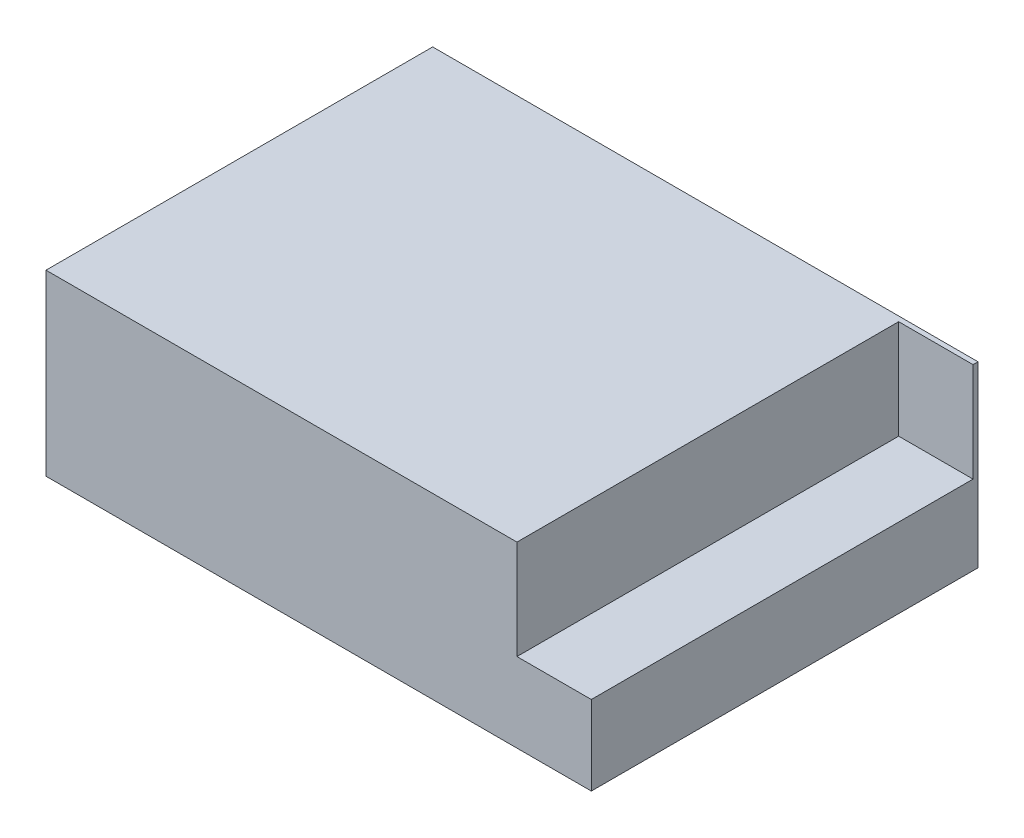
ISO-10303-21;
HEADER;
FILE_DESCRIPTION(('STEP AP214'),'2;1');
FILE_NAME('part.step','',(''),(''),'','','');
FILE_SCHEMA(('AUTOMOTIVE_DESIGN { 1 0 10303 214 1 1 1 1 }'));
ENDSEC;
DATA;
#1=APPLICATION_CONTEXT('core data for automotive mechanical design processes');
#2=APPLICATION_PROTOCOL_DEFINITION('international standard','automotive_design',2000,#1);
#3=PRODUCT_CONTEXT('',#1,'mechanical');
#4=PRODUCT('Part','Part','',(#3));
#5=PRODUCT_RELATED_PRODUCT_CATEGORY('part','',(#4));
#6=PRODUCT_DEFINITION_FORMATION('','',#4);
#7=PRODUCT_DEFINITION_CONTEXT('part definition',#1,'design');
#8=PRODUCT_DEFINITION('design','',#6,#7);
#9=PRODUCT_DEFINITION_SHAPE('','',#8);
#10=(LENGTH_UNIT() NAMED_UNIT(*) SI_UNIT(.MILLI.,.METRE.));
#11=(NAMED_UNIT(*) PLANE_ANGLE_UNIT() SI_UNIT($,.RADIAN.));
#12=(NAMED_UNIT(*) SI_UNIT($,.STERADIAN.) SOLID_ANGLE_UNIT());
#13=UNCERTAINTY_MEASURE_WITH_UNIT(LENGTH_MEASURE(1.E-05),#10,'distance_accuracy_value','');
#14=(GEOMETRIC_REPRESENTATION_CONTEXT(3) GLOBAL_UNCERTAINTY_ASSIGNED_CONTEXT((#13)) GLOBAL_UNIT_ASSIGNED_CONTEXT((#10,
#11,#12)) REPRESENTATION_CONTEXT('',''));
#15=CARTESIAN_POINT('',(0.,0.,0.));
#16=DIRECTION('',(0.,0.,1.));
#17=DIRECTION('',(1.,0.,0.));
#18=AXIS2_PLACEMENT_3D('',#15,#16,#17);
#19=CARTESIAN_POINT('',(0.,36.,0.));
#20=DIRECTION('',(1.,0.,0.));
#21=DIRECTION('',(0.,0.,-1.));
#22=AXIS2_PLACEMENT_3D('',#19,#20,#21);
#23=PLANE('',#22);
#24=DIRECTION('',(0.,0.,1.));
#25=VECTOR('',#24,1.);
#26=CARTESIAN_POINT('',(0.,0.,0.));
#27=LINE('',#26,#25);
#28=CARTESIAN_POINT('',(0.,0.,-78.));
#29=VERTEX_POINT('',#28);
#30=CARTESIAN_POINT('',(0.,0.,0.));
#31=VERTEX_POINT('',#30);
#32=EDGE_CURVE('E127',#29,#31,#27,.T.);
#33=ORIENTED_EDGE('',*,*,#32,.T.);
#34=DIRECTION('',(0.,-1.,0.));
#35=VECTOR('',#34,1.);
#36=CARTESIAN_POINT('',(0.,36.,0.));
#37=LINE('',#36,#35);
#38=CARTESIAN_POINT('',(0.,36.,0.));
#39=VERTEX_POINT('',#38);
#40=EDGE_CURVE('E11',#39,#31,#37,.T.);
#41=ORIENTED_EDGE('',*,*,#40,.F.);
#42=DIRECTION('',(0.,0.,1.));
#43=VECTOR('',#42,1.);
#44=CARTESIAN_POINT('',(0.,36.,0.));
#45=LINE('',#44,#43);
#46=CARTESIAN_POINT('',(0.,36.,-78.));
#47=VERTEX_POINT('',#46);
#48=EDGE_CURVE('E129',#47,#39,#45,.T.);
#49=ORIENTED_EDGE('',*,*,#48,.F.);
#50=DIRECTION('',(0.,-1.,0.));
#51=VECTOR('',#50,1.);
#52=CARTESIAN_POINT('',(0.,36.,-78.));
#53=LINE('',#52,#51);
#54=EDGE_CURVE('E135',#47,#29,#53,.T.);
#55=ORIENTED_EDGE('',*,*,#54,.T.);
#56=EDGE_LOOP('',(#33,#41,#49,#55));
#57=FACE_BOUND('',#56,.T.);
#58=ADVANCED_FACE('F32',(#57),#23,.F.);
#59=CARTESIAN_POINT('',(0.,36.,0.));
#60=DIRECTION('',(0.,0.,-1.));
#61=DIRECTION('',(-1.,0.,0.));
#62=AXIS2_PLACEMENT_3D('',#59,#60,#61);
#63=PLANE('',#62);
#64=DIRECTION('',(1.,0.,0.));
#65=VECTOR('',#64,1.);
#66=CARTESIAN_POINT('',(95.,16.,0.));
#67=LINE('',#66,#65);
#68=CARTESIAN_POINT('',(95.,16.,0.));
#69=VERTEX_POINT('',#68);
#70=CARTESIAN_POINT('',(110.,16.,0.));
#71=VERTEX_POINT('',#70);
#72=EDGE_CURVE('E118',#69,#71,#67,.T.);
#73=ORIENTED_EDGE('',*,*,#72,.F.);
#74=DIRECTION('',(0.,-1.,0.));
#75=VECTOR('',#74,1.);
#76=CARTESIAN_POINT('',(95.,36.,0.));
#77=LINE('',#76,#75);
#78=CARTESIAN_POINT('',(95.,36.,0.));
#79=VERTEX_POINT('',#78);
#80=EDGE_CURVE('E106',#79,#69,#77,.T.);
#81=ORIENTED_EDGE('',*,*,#80,.F.);
#82=DIRECTION('',(1.,0.,0.));
#83=VECTOR('',#82,1.);
#84=CARTESIAN_POINT('',(0.,36.,0.));
#85=LINE('',#84,#83);
#86=EDGE_CURVE('E81',#39,#79,#85,.T.);
#87=ORIENTED_EDGE('',*,*,#86,.F.);
#88=ORIENTED_EDGE('',*,*,#40,.T.);
#89=DIRECTION('',(1.,0.,0.));
#90=VECTOR('',#89,1.);
#91=CARTESIAN_POINT('',(0.,0.,0.));
#92=LINE('',#91,#90);
#93=CARTESIAN_POINT('',(110.,0.,0.));
#94=VERTEX_POINT('',#93);
#95=EDGE_CURVE('E138',#31,#94,#92,.T.);
#96=ORIENTED_EDGE('',*,*,#95,.T.);
#97=DIRECTION('',(0.,-1.,0.));
#98=VECTOR('',#97,1.);
#99=CARTESIAN_POINT('',(110.,36.,0.));
#100=LINE('',#99,#98);
#101=EDGE_CURVE('E39',#71,#94,#100,.T.);
#102=ORIENTED_EDGE('',*,*,#101,.F.);
#103=EDGE_LOOP('',(#73,#81,#87,#88,#96,#102));
#104=FACE_BOUND('',#103,.T.);
#105=ADVANCED_FACE('F151',(#104),#63,.F.);
#106=CARTESIAN_POINT('',(110.,36.,0.));
#107=DIRECTION('',(-1.,0.,0.));
#108=DIRECTION('',(0.,0.,1.));
#109=AXIS2_PLACEMENT_3D('',#106,#107,#108);
#110=PLANE('',#109);
#111=DIRECTION('',(0.,1.,0.));
#112=VECTOR('',#111,1.);
#113=CARTESIAN_POINT('',(110.,36.,-77.));
#114=LINE('',#113,#112);
#115=CARTESIAN_POINT('',(110.,16.,-77.));
#116=VERTEX_POINT('',#115);
#117=CARTESIAN_POINT('',(110.,36.,-77.));
#118=VERTEX_POINT('',#117);
#119=EDGE_CURVE('E46',#116,#118,#114,.T.);
#120=ORIENTED_EDGE('',*,*,#119,.F.);
#121=DIRECTION('',(0.,0.,1.));
#122=VECTOR('',#121,1.);
#123=CARTESIAN_POINT('',(110.,16.,-77.));
#124=LINE('',#123,#122);
#125=EDGE_CURVE('E109',#116,#71,#124,.T.);
#126=ORIENTED_EDGE('',*,*,#125,.T.);
#127=ORIENTED_EDGE('',*,*,#101,.T.);
#128=DIRECTION('',(0.,0.,-1.));
#129=VECTOR('',#128,1.);
#130=CARTESIAN_POINT('',(110.,0.,0.));
#131=LINE('',#130,#129);
#132=CARTESIAN_POINT('',(110.,0.,-78.));
#133=VERTEX_POINT('',#132);
#134=EDGE_CURVE('E141',#94,#133,#131,.T.);
#135=ORIENTED_EDGE('',*,*,#134,.T.);
#136=DIRECTION('',(0.,-1.,0.));
#137=VECTOR('',#136,1.);
#138=CARTESIAN_POINT('',(110.,36.,-78.));
#139=LINE('',#138,#137);
#140=CARTESIAN_POINT('',(110.,36.,-78.));
#141=VERTEX_POINT('',#140);
#142=EDGE_CURVE('E145',#141,#133,#139,.T.);
#143=ORIENTED_EDGE('',*,*,#142,.F.);
#144=DIRECTION('',(0.,0.,-1.));
#145=VECTOR('',#144,1.);
#146=CARTESIAN_POINT('',(110.,36.,0.));
#147=LINE('',#146,#145);
#148=EDGE_CURVE('E132',#118,#141,#147,.T.);
#149=ORIENTED_EDGE('',*,*,#148,.F.);
#150=EDGE_LOOP('',(#120,#126,#127,#135,#143,#149));
#151=FACE_BOUND('',#150,.T.);
#152=ADVANCED_FACE('F148',(#151),#110,.F.);
#153=CARTESIAN_POINT('',(0.,36.,-78.));
#154=DIRECTION('',(0.,0.,1.));
#155=DIRECTION('',(1.,0.,0.));
#156=AXIS2_PLACEMENT_3D('',#153,#154,#155);
#157=PLANE('',#156);
#158=DIRECTION('',(-1.,0.,0.));
#159=VECTOR('',#158,1.);
#160=CARTESIAN_POINT('',(0.,0.,-78.));
#161=LINE('',#160,#159);
#162=EDGE_CURVE('E75',#133,#29,#161,.T.);
#163=ORIENTED_EDGE('',*,*,#162,.T.);
#164=ORIENTED_EDGE('',*,*,#54,.F.);
#165=DIRECTION('',(-1.,0.,0.));
#166=VECTOR('',#165,1.);
#167=CARTESIAN_POINT('',(0.,36.,-78.));
#168=LINE('',#167,#166);
#169=EDGE_CURVE('E55',#141,#47,#168,.T.);
#170=ORIENTED_EDGE('',*,*,#169,.F.);
#171=ORIENTED_EDGE('',*,*,#142,.T.);
#172=EDGE_LOOP('',(#163,#164,#170,#171));
#173=FACE_BOUND('',#172,.T.);
#174=ADVANCED_FACE('F158',(#173),#157,.F.);
#175=CARTESIAN_POINT('',(0.,36.,0.));
#176=DIRECTION('',(0.,-1.,0.));
#177=DIRECTION('',(0.,0.,-1.));
#178=AXIS2_PLACEMENT_3D('',#175,#176,#177);
#179=PLANE('',#178);
#180=ORIENTED_EDGE('',*,*,#86,.T.);
#181=DIRECTION('',(0.,0.,1.));
#182=VECTOR('',#181,1.);
#183=CARTESIAN_POINT('',(95.,36.,-77.));
#184=LINE('',#183,#182);
#185=CARTESIAN_POINT('',(95.,36.,-77.));
#186=VERTEX_POINT('',#185);
#187=EDGE_CURVE('E125',#186,#79,#184,.T.);
#188=ORIENTED_EDGE('',*,*,#187,.F.);
#189=DIRECTION('',(-1.,0.,0.));
#190=VECTOR('',#189,1.);
#191=CARTESIAN_POINT('',(95.,36.,-77.));
#192=LINE('',#191,#190);
#193=EDGE_CURVE('E110',#118,#186,#192,.T.);
#194=ORIENTED_EDGE('',*,*,#193,.F.);
#195=ORIENTED_EDGE('',*,*,#148,.T.);
#196=ORIENTED_EDGE('',*,*,#169,.T.);
#197=ORIENTED_EDGE('',*,*,#48,.T.);
#198=EDGE_LOOP('',(#180,#188,#194,#195,#196,#197));
#199=FACE_BOUND('',#198,.T.);
#200=ADVANCED_FACE('F160',(#199),#179,.F.);
#201=CARTESIAN_POINT('',(0.,0.,0.));
#202=DIRECTION('',(0.,-1.,0.));
#203=DIRECTION('',(0.,0.,-1.));
#204=AXIS2_PLACEMENT_3D('',#201,#202,#203);
#205=PLANE('',#204);
#206=ORIENTED_EDGE('',*,*,#32,.F.);
#207=ORIENTED_EDGE('',*,*,#162,.F.);
#208=ORIENTED_EDGE('',*,*,#134,.F.);
#209=ORIENTED_EDGE('',*,*,#95,.F.);
#210=EDGE_LOOP('',(#206,#207,#208,#209));
#211=FACE_BOUND('',#210,.T.);
#212=ADVANCED_FACE('F155',(#211),#205,.T.);
#213=CARTESIAN_POINT('',(95.,36.,-77.));
#214=DIRECTION('',(-1.,0.,0.));
#215=DIRECTION('',(0.,0.,1.));
#216=AXIS2_PLACEMENT_3D('',#213,#214,#215);
#217=PLANE('',#216);
#218=ORIENTED_EDGE('',*,*,#80,.T.);
#219=DIRECTION('',(0.,0.,1.));
#220=VECTOR('',#219,1.);
#221=CARTESIAN_POINT('',(95.,16.,-77.));
#222=LINE('',#221,#220);
#223=CARTESIAN_POINT('',(95.,16.,-77.));
#224=VERTEX_POINT('',#223);
#225=EDGE_CURVE('E101',#224,#69,#222,.T.);
#226=ORIENTED_EDGE('',*,*,#225,.F.);
#227=DIRECTION('',(0.,-1.,0.));
#228=VECTOR('',#227,1.);
#229=CARTESIAN_POINT('',(95.,36.,-77.));
#230=LINE('',#229,#228);
#231=EDGE_CURVE('E105',#186,#224,#230,.T.);
#232=ORIENTED_EDGE('',*,*,#231,.F.);
#233=ORIENTED_EDGE('',*,*,#187,.T.);
#234=EDGE_LOOP('',(#218,#226,#232,#233));
#235=FACE_BOUND('',#234,.T.);
#236=ADVANCED_FACE('F103',(#235),#217,.F.);
#237=CARTESIAN_POINT('',(95.,16.,-77.));
#238=DIRECTION('',(0.,-1.,0.));
#239=DIRECTION('',(0.,0.,-1.));
#240=AXIS2_PLACEMENT_3D('',#237,#238,#239);
#241=PLANE('',#240);
#242=ORIENTED_EDGE('',*,*,#72,.T.);
#243=ORIENTED_EDGE('',*,*,#125,.F.);
#244=DIRECTION('',(1.,0.,0.));
#245=VECTOR('',#244,1.);
#246=CARTESIAN_POINT('',(95.,16.,-77.));
#247=LINE('',#246,#245);
#248=EDGE_CURVE('E112',#224,#116,#247,.T.);
#249=ORIENTED_EDGE('',*,*,#248,.F.);
#250=ORIENTED_EDGE('',*,*,#225,.T.);
#251=EDGE_LOOP('',(#242,#243,#249,#250));
#252=FACE_BOUND('',#251,.T.);
#253=ADVANCED_FACE('F113',(#252),#241,.F.);
#254=CARTESIAN_POINT('',(0.,0.,-77.));
#255=DIRECTION('',(0.,0.,1.));
#256=DIRECTION('',(1.,0.,0.));
#257=AXIS2_PLACEMENT_3D('',#254,#255,#256);
#258=PLANE('',#257);
#259=ORIENTED_EDGE('',*,*,#231,.T.);
#260=ORIENTED_EDGE('',*,*,#248,.T.);
#261=ORIENTED_EDGE('',*,*,#119,.T.);
#262=ORIENTED_EDGE('',*,*,#193,.T.);
#263=EDGE_LOOP('',(#259,#260,#261,#262));
#264=FACE_BOUND('',#263,.T.);
#265=ADVANCED_FACE('F116',(#264),#258,.T.);
#266=CLOSED_SHELL('',(#58,#105,#152,#174,#200,#212,#236,#253,#265));
#267=MANIFOLD_SOLID_BREP('B2',#266);
#268=ADVANCED_BREP_SHAPE_REPRESENTATION('',(#18,#267),#14);
#269=SHAPE_DEFINITION_REPRESENTATION(#9,#268);
ENDSEC;
END-ISO-10303-21;
